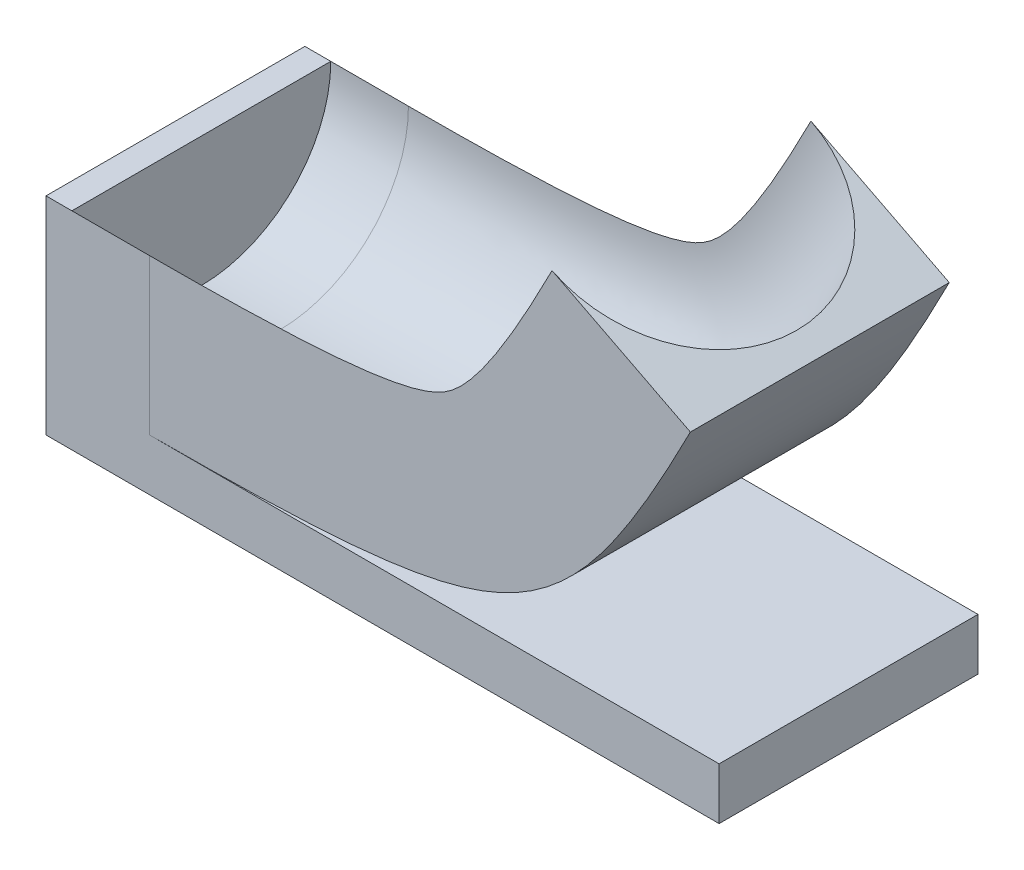
ISO-10303-21;
HEADER;
FILE_DESCRIPTION(('STEP AP214'),'2;1');
FILE_NAME('part.step','',(''),(''),'','','');
FILE_SCHEMA(('AUTOMOTIVE_DESIGN { 1 0 10303 214 1 1 1 1 }'));
ENDSEC;
DATA;
#1=APPLICATION_CONTEXT('core data for automotive mechanical design processes');
#2=APPLICATION_PROTOCOL_DEFINITION('international standard','automotive_design',2000,#1);
#3=PRODUCT_CONTEXT('',#1,'mechanical');
#4=PRODUCT('Part','Part','',(#3));
#5=PRODUCT_RELATED_PRODUCT_CATEGORY('part','',(#4));
#6=PRODUCT_DEFINITION_FORMATION('','',#4);
#7=PRODUCT_DEFINITION_CONTEXT('part definition',#1,'design');
#8=PRODUCT_DEFINITION('design','',#6,#7);
#9=PRODUCT_DEFINITION_SHAPE('','',#8);
#10=(LENGTH_UNIT() NAMED_UNIT(*) SI_UNIT(.MILLI.,.METRE.));
#11=(NAMED_UNIT(*) PLANE_ANGLE_UNIT() SI_UNIT($,.RADIAN.));
#12=(NAMED_UNIT(*) SI_UNIT($,.STERADIAN.) SOLID_ANGLE_UNIT());
#13=UNCERTAINTY_MEASURE_WITH_UNIT(LENGTH_MEASURE(1.E-05),#10,'distance_accuracy_value','');
#14=(GEOMETRIC_REPRESENTATION_CONTEXT(3) GLOBAL_UNCERTAINTY_ASSIGNED_CONTEXT((#13)) GLOBAL_UNIT_ASSIGNED_CONTEXT((#10,
#11,#12)) REPRESENTATION_CONTEXT('',''));
#15=CARTESIAN_POINT('',(0.,0.,0.));
#16=DIRECTION('',(0.,0.,1.));
#17=DIRECTION('',(1.,0.,0.));
#18=AXIS2_PLACEMENT_3D('',#15,#16,#17);
#19=CARTESIAN_POINT('',(-45.,40.,0.));
#20=DIRECTION('',(-1.,0.,0.));
#21=DIRECTION('',(0.,0.,1.));
#22=AXIS2_PLACEMENT_3D('',#19,#20,#21);
#23=CYLINDRICAL_SURFACE('',#22,25.);
#24=DIRECTION('',(-1.,0.,0.));
#25=VECTOR('',#24,1.);
#26=CARTESIAN_POINT('',(-45.,40.,-25.));
#27=LINE('',#26,#25);
#28=CARTESIAN_POINT('',(-45.,40.,-25.));
#29=VERTEX_POINT('',#28);
#30=CARTESIAN_POINT('',(-60.,40.,-25.));
#31=VERTEX_POINT('',#30);
#32=EDGE_CURVE('E113',#29,#31,#27,.T.);
#33=ORIENTED_EDGE('',*,*,#32,.T.);
#34=CARTESIAN_POINT('',(-60.,40.,0.));
#35=DIRECTION('',(-1.,0.,0.));
#36=DIRECTION('',(0.,0.,1.));
#37=AXIS2_PLACEMENT_3D('',#34,#35,#36);
#38=CIRCLE('',#37,25.);
#39=CARTESIAN_POINT('',(-60.,40.,25.));
#40=VERTEX_POINT('',#39);
#41=EDGE_CURVE('E11',#31,#40,#38,.T.);
#42=ORIENTED_EDGE('',*,*,#41,.T.);
#43=DIRECTION('',(-1.,0.,0.));
#44=VECTOR('',#43,1.);
#45=CARTESIAN_POINT('',(-45.,40.,25.));
#46=LINE('',#45,#44);
#47=CARTESIAN_POINT('',(-45.,40.,25.));
#48=VERTEX_POINT('',#47);
#49=EDGE_CURVE('E119',#48,#40,#46,.T.);
#50=ORIENTED_EDGE('',*,*,#49,.F.);
#51=CARTESIAN_POINT('',(-45.,40.,0.));
#52=DIRECTION('',(1.,0.,0.));
#53=DIRECTION('',(0.,0.,-1.));
#54=AXIS2_PLACEMENT_3D('',#51,#52,#53);
#55=CIRCLE('',#54,25.);
#56=EDGE_CURVE('E198',#48,#29,#55,.T.);
#57=ORIENTED_EDGE('',*,*,#56,.T.);
#58=EDGE_LOOP('',(#33,#42,#50,#57));
#59=FACE_BOUND('',#58,.T.);
#60=ADVANCED_FACE('F43',(#59),#23,.F.);
#61=CARTESIAN_POINT('',(65.,10.,25.));
#62=DIRECTION('',(-1.,0.,0.));
#63=DIRECTION('',(0.,0.,1.));
#64=AXIS2_PLACEMENT_3D('',#61,#62,#63);
#65=PLANE('',#64);
#66=DIRECTION('',(0.,0.,-1.));
#67=VECTOR('',#66,1.);
#68=CARTESIAN_POINT('',(65.,0.,25.));
#69=LINE('',#68,#67);
#70=CARTESIAN_POINT('',(65.,0.,25.));
#71=VERTEX_POINT('',#70);
#72=CARTESIAN_POINT('',(65.,0.,-25.));
#73=VERTEX_POINT('',#72);
#74=EDGE_CURVE('E106',#71,#73,#69,.T.);
#75=ORIENTED_EDGE('',*,*,#74,.T.);
#76=DIRECTION('',(0.,-1.,0.));
#77=VECTOR('',#76,1.);
#78=CARTESIAN_POINT('',(65.,10.,-25.));
#79=LINE('',#78,#77);
#80=CARTESIAN_POINT('',(65.,10.,-25.));
#81=VERTEX_POINT('',#80);
#82=EDGE_CURVE('E52',#81,#73,#79,.T.);
#83=ORIENTED_EDGE('',*,*,#82,.F.);
#84=DIRECTION('',(0.,0.,-1.));
#85=VECTOR('',#84,1.);
#86=CARTESIAN_POINT('',(65.,10.,25.));
#87=LINE('',#86,#85);
#88=CARTESIAN_POINT('',(65.,10.,25.));
#89=VERTEX_POINT('',#88);
#90=EDGE_CURVE('E100',#89,#81,#87,.T.);
#91=ORIENTED_EDGE('',*,*,#90,.F.);
#92=DIRECTION('',(0.,-1.,0.));
#93=VECTOR('',#92,1.);
#94=CARTESIAN_POINT('',(65.,10.,25.));
#95=LINE('',#94,#93);
#96=EDGE_CURVE('E91',#89,#71,#95,.T.);
#97=ORIENTED_EDGE('',*,*,#96,.T.);
#98=EDGE_LOOP('',(#75,#83,#91,#97));
#99=FACE_BOUND('',#98,.T.);
#100=ADVANCED_FACE('F45',(#99),#65,.F.);
#101=CARTESIAN_POINT('',(-65.,10.,-25.));
#102=DIRECTION('',(0.,0.,1.));
#103=DIRECTION('',(1.,0.,0.));
#104=AXIS2_PLACEMENT_3D('',#101,#102,#103);
#105=PLANE('',#104);
#106=DIRECTION('',(-1.,0.,0.));
#107=VECTOR('',#106,1.);
#108=CARTESIAN_POINT('',(-60.,40.,-25.));
#109=LINE('',#108,#107);
#110=CARTESIAN_POINT('',(-65.,40.,-25.));
#111=VERTEX_POINT('',#110);
#112=EDGE_CURVE('E174',#31,#111,#109,.T.);
#113=ORIENTED_EDGE('',*,*,#112,.F.);
#114=ORIENTED_EDGE('',*,*,#32,.F.);
#115=DIRECTION('',(0.,-1.,0.));
#116=VECTOR('',#115,1.);
#117=CARTESIAN_POINT('',(-45.,40.,-25.));
#118=LINE('',#117,#116);
#119=CARTESIAN_POINT('',(-45.,10.,-25.));
#120=VERTEX_POINT('',#119);
#121=EDGE_CURVE('E193',#29,#120,#118,.T.);
#122=ORIENTED_EDGE('',*,*,#121,.T.);
#123=DIRECTION('',(-1.,0.,0.));
#124=VECTOR('',#123,1.);
#125=CARTESIAN_POINT('',(-65.,10.,-25.));
#126=LINE('',#125,#124);
#127=EDGE_CURVE('E135',#81,#120,#126,.T.);
#128=ORIENTED_EDGE('',*,*,#127,.F.);
#129=ORIENTED_EDGE('',*,*,#82,.T.);
#130=DIRECTION('',(-1.,0.,0.));
#131=VECTOR('',#130,1.);
#132=CARTESIAN_POINT('',(-65.,0.,-25.));
#133=LINE('',#132,#131);
#134=CARTESIAN_POINT('',(-65.,0.,-25.));
#135=VERTEX_POINT('',#134);
#136=EDGE_CURVE('E110',#73,#135,#133,.T.);
#137=ORIENTED_EDGE('',*,*,#136,.T.);
#138=DIRECTION('',(0.,-1.,0.));
#139=VECTOR('',#138,1.);
#140=CARTESIAN_POINT('',(-65.,10.,-25.));
#141=LINE('',#140,#139);
#142=EDGE_CURVE('E129',#111,#135,#141,.T.);
#143=ORIENTED_EDGE('',*,*,#142,.F.);
#144=EDGE_LOOP('',(#113,#114,#122,#128,#129,#137,#143));
#145=FACE_BOUND('',#144,.T.);
#146=ADVANCED_FACE('F292',(#145),#105,.F.);
#147=CARTESIAN_POINT('',(-65.,10.,25.));
#148=DIRECTION('',(1.,0.,0.));
#149=DIRECTION('',(0.,0.,-1.));
#150=AXIS2_PLACEMENT_3D('',#147,#148,#149);
#151=PLANE('',#150);
#152=DIRECTION('',(0.,0.,1.));
#153=VECTOR('',#152,1.);
#154=CARTESIAN_POINT('',(-65.,0.,25.));
#155=LINE('',#154,#153);
#156=CARTESIAN_POINT('',(-65.,0.,25.));
#157=VERTEX_POINT('',#156);
#158=EDGE_CURVE('E101',#135,#157,#155,.T.);
#159=ORIENTED_EDGE('',*,*,#158,.T.);
#160=DIRECTION('',(0.,-1.,0.));
#161=VECTOR('',#160,1.);
#162=CARTESIAN_POINT('',(-65.,10.,25.));
#163=LINE('',#162,#161);
#164=CARTESIAN_POINT('',(-65.,40.,25.));
#165=VERTEX_POINT('',#164);
#166=EDGE_CURVE('E95',#165,#157,#163,.T.);
#167=ORIENTED_EDGE('',*,*,#166,.F.);
#168=DIRECTION('',(0.,0.,-1.));
#169=VECTOR('',#168,1.);
#170=CARTESIAN_POINT('',(-65.,40.,-25.));
#171=LINE('',#170,#169);
#172=EDGE_CURVE('E271',#165,#111,#171,.T.);
#173=ORIENTED_EDGE('',*,*,#172,.T.);
#174=ORIENTED_EDGE('',*,*,#142,.T.);
#175=EDGE_LOOP('',(#159,#167,#173,#174));
#176=FACE_BOUND('',#175,.T.);
#177=ADVANCED_FACE('F345',(#176),#151,.F.);
#178=CARTESIAN_POINT('',(-65.,10.,25.));
#179=DIRECTION('',(0.,0.,-1.));
#180=DIRECTION('',(-1.,0.,0.));
#181=AXIS2_PLACEMENT_3D('',#178,#179,#180);
#182=PLANE('',#181);
#183=DIRECTION('',(1.,0.,0.));
#184=VECTOR('',#183,1.);
#185=CARTESIAN_POINT('',(-65.,0.,25.));
#186=LINE('',#185,#184);
#187=EDGE_CURVE('E88',#157,#71,#186,.T.);
#188=ORIENTED_EDGE('',*,*,#187,.T.);
#189=ORIENTED_EDGE('',*,*,#96,.F.);
#190=DIRECTION('',(1.,0.,0.));
#191=VECTOR('',#190,1.);
#192=CARTESIAN_POINT('',(-65.,10.,25.));
#193=LINE('',#192,#191);
#194=CARTESIAN_POINT('',(-45.,10.,25.));
#195=VERTEX_POINT('',#194);
#196=EDGE_CURVE('E68',#195,#89,#193,.T.);
#197=ORIENTED_EDGE('',*,*,#196,.F.);
#198=DIRECTION('',(0.,1.,0.));
#199=VECTOR('',#198,1.);
#200=CARTESIAN_POINT('',(-45.,10.,25.));
#201=LINE('',#200,#199);
#202=EDGE_CURVE('E59',#195,#48,#201,.T.);
#203=ORIENTED_EDGE('',*,*,#202,.T.);
#204=ORIENTED_EDGE('',*,*,#49,.T.);
#205=DIRECTION('',(-1.,0.,0.));
#206=VECTOR('',#205,1.);
#207=CARTESIAN_POINT('',(-60.,40.,25.));
#208=LINE('',#207,#206);
#209=EDGE_CURVE('E264',#40,#165,#208,.T.);
#210=ORIENTED_EDGE('',*,*,#209,.T.);
#211=ORIENTED_EDGE('',*,*,#166,.T.);
#212=EDGE_LOOP('',(#188,#189,#197,#203,#204,#210,#211));
#213=FACE_BOUND('',#212,.T.);
#214=ADVANCED_FACE('F90',(#213),#182,.F.);
#215=CARTESIAN_POINT('',(0.,10.,0.));
#216=DIRECTION('',(0.,-1.,0.));
#217=DIRECTION('',(0.,0.,-1.));
#218=AXIS2_PLACEMENT_3D('',#215,#216,#217);
#219=PLANE('',#218);
#220=ORIENTED_EDGE('',*,*,#127,.T.);
#221=DIRECTION('',(0.,0.,1.));
#222=VECTOR('',#221,1.);
#223=CARTESIAN_POINT('',(-45.,10.,-25.));
#224=LINE('',#223,#222);
#225=EDGE_CURVE('E197',#120,#195,#224,.T.);
#226=ORIENTED_EDGE('',*,*,#225,.T.);
#227=ORIENTED_EDGE('',*,*,#196,.T.);
#228=ORIENTED_EDGE('',*,*,#90,.T.);
#229=EDGE_LOOP('',(#220,#226,#227,#228));
#230=FACE_BOUND('',#229,.T.);
#231=ADVANCED_FACE('F343',(#230),#219,.F.);
#232=CARTESIAN_POINT('',(0.,0.,0.));
#233=DIRECTION('',(0.,-1.,0.));
#234=DIRECTION('',(0.,0.,-1.));
#235=AXIS2_PLACEMENT_3D('',#232,#233,#234);
#236=PLANE('',#235);
#237=ORIENTED_EDGE('',*,*,#158,.F.);
#238=ORIENTED_EDGE('',*,*,#136,.F.);
#239=ORIENTED_EDGE('',*,*,#74,.F.);
#240=ORIENTED_EDGE('',*,*,#187,.F.);
#241=EDGE_LOOP('',(#237,#238,#239,#240));
#242=FACE_BOUND('',#241,.T.);
#243=ADVANCED_FACE('F109',(#242),#236,.T.);
#244=CARTESIAN_POINT('',(32.7371353433975,76.3738672966498,0.));
#245=DIRECTION('',(0.454954691865992,0.8905145862641,0.));
#246=DIRECTION('',(0.,0.,-1.));
#247=AXIS2_PLACEMENT_3D('',#244,#245,#246);
#248=PLANE('',#247);
#249=CARTESIAN_POINT('',(32.7371353433975,76.3738672966498,0.));
#250=DIRECTION('',(0.454954691865992,0.8905145862641,0.));
#251=DIRECTION('',(0.,0.,-1.));
#252=AXIS2_PLACEMENT_3D('',#249,#250,#251);
#253=CIRCLE('',#252,25.);
#254=CARTESIAN_POINT('',(32.7371353433975,76.3738672966498,25.));
#255=VERTEX_POINT('',#254);
#256=CARTESIAN_POINT('',(32.7371353433975,76.3738672966498,-25.));
#257=VERTEX_POINT('',#256);
#258=EDGE_CURVE('E169',#255,#257,#253,.T.);
#259=ORIENTED_EDGE('',*,*,#258,.F.);
#260=DIRECTION('',(-0.8905145862641,0.454954691865992,0.));
#261=VECTOR('',#260,1.);
#262=CARTESIAN_POINT('',(59.4525729313205,62.72522654067,25.));
#263=LINE('',#262,#261);
#264=CARTESIAN_POINT('',(59.4525729313205,62.72522654067,25.));
#265=VERTEX_POINT('',#264);
#266=EDGE_CURVE('E166',#265,#255,#263,.T.);
#267=ORIENTED_EDGE('',*,*,#266,.F.);
#268=DIRECTION('',(0.,0.,1.));
#269=VECTOR('',#268,1.);
#270=CARTESIAN_POINT('',(59.4525729313205,62.72522654067,-25.));
#271=LINE('',#270,#269);
#272=CARTESIAN_POINT('',(59.4525729313205,62.72522654067,-25.));
#273=VERTEX_POINT('',#272);
#274=EDGE_CURVE('E180',#273,#265,#271,.T.);
#275=ORIENTED_EDGE('',*,*,#274,.F.);
#276=DIRECTION('',(0.8905145862641,-0.454954691865992,0.));
#277=VECTOR('',#276,1.);
#278=CARTESIAN_POINT('',(32.7371353433975,76.3738672966498,-25.));
#279=LINE('',#278,#277);
#280=EDGE_CURVE('E173',#257,#273,#279,.T.);
#281=ORIENTED_EDGE('',*,*,#280,.F.);
#282=EDGE_LOOP('',(#259,#267,#275,#281));
#283=FACE_BOUND('',#282,.T.);
#284=ADVANCED_FACE('F320',(#283),#248,.T.);
#285=CARTESIAN_POINT('',(32.7371353433975,76.3738672966498,25.));
#286=CARTESIAN_POINT('',(30.4576584331843,71.912087972913,25.));
#287=CARTESIAN_POINT('',(28.5374108914578,68.3308047849084,25.));
#288=CARTESIAN_POINT('',(25.1457688744993,62.2889555036833,25.));
#289=CARTESIAN_POINT('',(23.6909410100106,59.8587850367874,25.));
#290=CARTESIAN_POINT('',(21.0934075655135,55.7683527124995,25.));
#291=CARTESIAN_POINT('',(19.9724711782589,54.1429079937814,25.));
#292=CARTESIAN_POINT('',(17.9697944808011,51.4400266548396,25.));
#293=CARTESIAN_POINT('',(17.1172217765495,50.4006131730246,25.));
#294=CARTESIAN_POINT('',(15.5781073791996,48.6748764102266,25.));
#295=CARTESIAN_POINT('',(14.9224647848668,48.0227432371391,25.));
#296=CARTESIAN_POINT('',(13.77240427649,46.9830336117312,25.));
#297=CARTESIAN_POINT('',(13.2692963313054,46.58471492174,25.));
#298=CARTESIAN_POINT('',(12.2341612844009,45.8507825019916,25.));
#299=CARTESIAN_POINT('',(11.7632838430434,45.5592003929403,25.));
#300=CARTESIAN_POINT('',(10.7138631745653,44.9904420790086,25.));
#301=CARTESIAN_POINT('',(10.134309761004,44.7148248879966,25.));
#302=CARTESIAN_POINT('',(8.70646019811122,44.1373054402215,25.));
#303=CARTESIAN_POINT('',(7.90365503694967,43.8546965721304,25.));
#304=CARTESIAN_POINT('',(5.96909418007388,43.2845507740936,25.));
#305=CARTESIAN_POINT('',(4.83812856138315,42.9987723800971,25.));
#306=CARTESIAN_POINT('',(0.846452082596889,42.1633382147724,25.));
#307=CARTESIAN_POINT('',(-2.54537940591736,41.6551857739707,25.));
#308=CARTESIAN_POINT('',(-11.2534452960898,40.8265262346096,25.));
#309=CARTESIAN_POINT('',(-16.5485216725974,40.5092621103665,25.));
#310=CARTESIAN_POINT('',(-26.0864672224142,40.1991701926098,25.));
#311=CARTESIAN_POINT('',(-29.531485438214,40.1229990162226,25.));
#312=CARTESIAN_POINT('',(-36.9180910773991,40.023414426792,25.));
#313=CARTESIAN_POINT('',(-40.865629788895,40.,25.));
#314=CARTESIAN_POINT('',(-45.,40.,25.));
#315=CARTESIAN_POINT('',(77.2628646566025,53.6261327033502,25.));
#316=CARTESIAN_POINT('',(74.7404339630525,48.6888029748954,25.));
#317=CARTESIAN_POINT('',(72.5091800200485,44.5177782455099,25.));
#318=CARTESIAN_POINT('',(68.3740626433873,37.1515067575878,25.));
#319=CARTESIAN_POINT('',(66.4531985324368,33.9270293004018,25.));
#320=CARTESIAN_POINT('',(62.748382887487,28.0929186429048,25.));
#321=CARTESIAN_POINT('',(60.945208360556,25.454323752528,25.));
#322=CARTESIAN_POINT('',(57.3450647069406,20.5954461432107,25.));
#323=CARTESIAN_POINT('',(55.5202100336207,18.3400372055243,25.));
#324=CARTESIAN_POINT('',(51.8058692861644,14.1753206925112,25.));
#325=CARTESIAN_POINT('',(49.884027115338,12.2259868037824,25.));
#326=CARTESIAN_POINT('',(45.8730393385466,8.59986229582647,25.));
#327=CARTESIAN_POINT('',(43.7925836503708,6.93381397234611,25.));
#328=CARTESIAN_POINT('',(39.5499502598855,3.92569891308391,25.));
#329=CARTESIAN_POINT('',(37.3289544236783,2.54387438233845,25.));
#330=CARTESIAN_POINT('',(32.7973706969074,0.0878755641934496,25.));
#331=CARTESIAN_POINT('',(30.4877926427101,-0.987858342562802,25.));
#332=CARTESIAN_POINT('',(25.8488402481368,-2.8641658370122,25.));
#333=CARTESIAN_POINT('',(23.4750910519021,-3.68238176594442,25.));
#334=CARTESIAN_POINT('',(18.6671003594439,-5.09937295735687,25.));
#335=CARTESIAN_POINT('',(16.2320687186857,-5.69990698752689,25.));
#336=CARTESIAN_POINT('',(8.78688344166669,-7.25813992619755,25.));
#337=CARTESIAN_POINT('',(3.56698644661735,-7.9890369597965,25.));
#338=CARTESIAN_POINT('',(-7.89260531017422,-9.07953164972264,25.));
#339=CARTESIAN_POINT('',(-14.1775671400474,-9.44007264284781,25.));
#340=CARTESIAN_POINT('',(-24.8348773355266,-9.7865566646115,25.));
#341=CARTESIAN_POINT('',(-28.5896870340086,-9.86884761866619,25.));
#342=CARTESIAN_POINT('',(-36.5118339028202,-9.97565225626279,25.));
#343=CARTESIAN_POINT('',(-40.6772652117149,-9.99999999999999,25.));
#344=CARTESIAN_POINT('',(-45.,-9.99999999999999,25.));
#345=CARTESIAN_POINT('',(77.2628646566025,53.6261327033502,-25.));
#346=CARTESIAN_POINT('',(74.7404339630525,48.6888029748954,-25.));
#347=CARTESIAN_POINT('',(72.5091800200485,44.5177782455099,-25.));
#348=CARTESIAN_POINT('',(68.3740626433873,37.1515067575878,-25.));
#349=CARTESIAN_POINT('',(66.4531985324368,33.9270293004018,-25.));
#350=CARTESIAN_POINT('',(62.748382887487,28.0929186429048,-25.));
#351=CARTESIAN_POINT('',(60.945208360556,25.454323752528,-25.));
#352=CARTESIAN_POINT('',(57.3450647069406,20.5954461432107,-25.));
#353=CARTESIAN_POINT('',(55.5202100336207,18.3400372055243,-25.));
#354=CARTESIAN_POINT('',(51.8058692861644,14.1753206925112,-25.));
#355=CARTESIAN_POINT('',(49.884027115338,12.2259868037824,-25.));
#356=CARTESIAN_POINT('',(45.8730393385466,8.59986229582647,-25.));
#357=CARTESIAN_POINT('',(43.7925836503708,6.93381397234611,-25.));
#358=CARTESIAN_POINT('',(39.5499502598855,3.92569891308391,-25.));
#359=CARTESIAN_POINT('',(37.3289544236783,2.54387438233845,-25.));
#360=CARTESIAN_POINT('',(32.7973706969074,0.0878755641934496,-25.));
#361=CARTESIAN_POINT('',(30.4877926427101,-0.987858342562802,-25.));
#362=CARTESIAN_POINT('',(25.8488402481368,-2.8641658370122,-25.));
#363=CARTESIAN_POINT('',(23.4750910519021,-3.68238176594442,-25.));
#364=CARTESIAN_POINT('',(18.6671003594439,-5.09937295735687,-25.));
#365=CARTESIAN_POINT('',(16.2320687186857,-5.69990698752689,-25.));
#366=CARTESIAN_POINT('',(8.78688344166669,-7.25813992619755,-25.));
#367=CARTESIAN_POINT('',(3.56698644661735,-7.9890369597965,-25.));
#368=CARTESIAN_POINT('',(-7.89260531017422,-9.07953164972264,-25.));
#369=CARTESIAN_POINT('',(-14.1775671400474,-9.44007264284781,-25.));
#370=CARTESIAN_POINT('',(-24.8348773355266,-9.7865566646115,-25.));
#371=CARTESIAN_POINT('',(-28.5896870340086,-9.86884761866619,-25.));
#372=CARTESIAN_POINT('',(-36.5118339028202,-9.97565225626279,-25.));
#373=CARTESIAN_POINT('',(-40.6772652117149,-9.99999999999999,-25.));
#374=CARTESIAN_POINT('',(-45.,-9.99999999999999,-25.));
#375=CARTESIAN_POINT('',(32.7371353433975,76.3738672966498,-25.));
#376=CARTESIAN_POINT('',(30.4576584331843,71.912087972913,-25.));
#377=CARTESIAN_POINT('',(28.5374108914578,68.3308047849084,-25.));
#378=CARTESIAN_POINT('',(25.1457688744993,62.2889555036833,-25.));
#379=CARTESIAN_POINT('',(23.6909410100106,59.8587850367874,-25.));
#380=CARTESIAN_POINT('',(21.0934075655135,55.7683527124995,-25.));
#381=CARTESIAN_POINT('',(19.9724711782589,54.1429079937814,-25.));
#382=CARTESIAN_POINT('',(17.9697944808011,51.4400266548396,-25.));
#383=CARTESIAN_POINT('',(17.1172217765495,50.4006131730246,-25.));
#384=CARTESIAN_POINT('',(15.5781073791996,48.6748764102266,-25.));
#385=CARTESIAN_POINT('',(14.9224647848668,48.0227432371391,-25.));
#386=CARTESIAN_POINT('',(13.77240427649,46.9830336117312,-25.));
#387=CARTESIAN_POINT('',(13.2692963313054,46.58471492174,-25.));
#388=CARTESIAN_POINT('',(12.2341612844009,45.8507825019916,-25.));
#389=CARTESIAN_POINT('',(11.7632838430434,45.5592003929403,-25.));
#390=CARTESIAN_POINT('',(10.7138631745653,44.9904420790086,-25.));
#391=CARTESIAN_POINT('',(10.134309761004,44.7148248879966,-25.));
#392=CARTESIAN_POINT('',(8.70646019811122,44.1373054402215,-25.));
#393=CARTESIAN_POINT('',(7.90365503694967,43.8546965721304,-25.));
#394=CARTESIAN_POINT('',(5.96909418007388,43.2845507740936,-25.));
#395=CARTESIAN_POINT('',(4.83812856138315,42.9987723800971,-25.));
#396=CARTESIAN_POINT('',(0.846452082596889,42.1633382147724,-25.));
#397=CARTESIAN_POINT('',(-2.54537940591736,41.6551857739707,-25.));
#398=CARTESIAN_POINT('',(-11.2534452960898,40.8265262346096,-25.));
#399=CARTESIAN_POINT('',(-16.5485216725974,40.5092621103665,-25.));
#400=CARTESIAN_POINT('',(-26.0864672224142,40.1991701926098,-25.));
#401=CARTESIAN_POINT('',(-29.531485438214,40.1229990162226,-25.));
#402=CARTESIAN_POINT('',(-36.9180910773991,40.023414426792,-25.));
#403=CARTESIAN_POINT('',(-40.865629788895,40.,-25.));
#404=CARTESIAN_POINT('',(-45.,40.,-25.));
#405=(BOUNDED_SURFACE() B_SPLINE_SURFACE(3,3,((#285,#286,#287,#288,#289,#290,#291,#292,#293,
#294,#295,#296,#297,#298,#299,#300,#301,#302,#303,#304,#305,#306,#307,#308,#309,#310,#311,#312,
#313,#314),(#315,#316,#317,#318,#319,#320,#321,#322,#323,#324,#325,#326,#327,#328,#329,#330,
#331,#332,#333,#334,#335,#336,#337,#338,#339,#340,#341,#342,#343,#344),(#345,#346,#347,#348,
#349,#350,#351,#352,#353,#354,#355,#356,#357,#358,#359,#360,#361,#362,#363,#364,#365,#366,#367,
#368,#369,#370,#371,#372,#373,#374),(#375,#376,#377,#378,#379,#380,#381,#382,#383,#384,#385,
#386,#387,#388,#389,#390,#391,#392,#393,#394,#395,#396,#397,#398,#399,#400,#401,#402,#403,
#404)),.UNSPECIFIED.,.F.,.F.,.F.) B_SPLINE_SURFACE_WITH_KNOTS((4,4),(4,2,2,2,2,2,2,2,2,2,2,2,2,
2,4),(0.,1.),(0.,0.0537273683940442,0.107454736788088,0.161182105182133,0.214909473576177,
0.268636841970221,0.322364210364265,0.376091578758309,0.429818947152353,0.483546315546398,
0.537273683940442,0.64472842072853,0.752183157516619,0.805910525910663,0.859637894304707),
.UNSPECIFIED.) GEOMETRIC_REPRESENTATION_ITEM() RATIONAL_B_SPLINE_SURFACE(((1.,1.,1.,1.,1.,1.,1.,
1.,1.,1.,1.,1.,1.,1.,1.,1.,1.,1.,1.,1.,1.,1.,1.,1.,1.,1.,1.,1.,1.,1.),(0.333333333333333,
0.333333333333333,0.333333333333333,0.333333333333333,0.333333333333333,0.333333333333333,
0.333333333333333,0.333333333333333,0.333333333333333,0.333333333333333,0.333333333333333,
0.333333333333333,0.333333333333333,0.333333333333333,0.333333333333333,0.333333333333333,
0.333333333333333,0.333333333333333,0.333333333333333,0.333333333333333,0.333333333333333,
0.333333333333333,0.333333333333333,0.333333333333333,0.333333333333333,0.333333333333333,
0.333333333333333,0.333333333333333,0.333333333333333,0.333333333333333),(0.333333333333333,
0.333333333333333,0.333333333333333,0.333333333333333,0.333333333333333,0.333333333333333,
0.333333333333333,0.333333333333333,0.333333333333333,0.333333333333333,0.333333333333333,
0.333333333333333,0.333333333333333,0.333333333333333,0.333333333333333,0.333333333333333,
0.333333333333333,0.333333333333333,0.333333333333333,0.333333333333333,0.333333333333333,
0.333333333333333,0.333333333333333,0.333333333333333,0.333333333333333,0.333333333333333,
0.333333333333333,0.333333333333333,0.333333333333333,0.333333333333333),(1.,1.,1.,1.,1.,1.,1.,
1.,1.,1.,1.,1.,1.,1.,1.,1.,1.,1.,1.,1.,1.,1.,1.,1.,1.,1.,1.,1.,1.,1.))) REPRESENTATION_ITEM('') SURFACE());
#406=CARTESIAN_POINT('',(32.7371353433975,76.3738672966498,-25.));
#407=CARTESIAN_POINT('',(30.4576584331843,71.912087972913,-25.));
#408=CARTESIAN_POINT('',(28.5374108914578,68.3308047849084,-25.));
#409=CARTESIAN_POINT('',(25.1457688744993,62.2889555036833,-25.));
#410=CARTESIAN_POINT('',(23.6909410100106,59.8587850367874,-25.));
#411=CARTESIAN_POINT('',(21.0934075655135,55.7683527124995,-25.));
#412=CARTESIAN_POINT('',(19.9724711782589,54.1429079937814,-25.));
#413=CARTESIAN_POINT('',(17.9697944808011,51.4400266548396,-25.));
#414=CARTESIAN_POINT('',(17.1172217765495,50.4006131730246,-25.));
#415=CARTESIAN_POINT('',(15.5781073791996,48.6748764102266,-25.));
#416=CARTESIAN_POINT('',(14.9224647848668,48.0227432371391,-25.));
#417=CARTESIAN_POINT('',(13.77240427649,46.9830336117312,-25.));
#418=CARTESIAN_POINT('',(13.2692963313054,46.58471492174,-25.));
#419=CARTESIAN_POINT('',(12.2341612844009,45.8507825019916,-25.));
#420=CARTESIAN_POINT('',(11.7632838430434,45.5592003929403,-25.));
#421=CARTESIAN_POINT('',(10.7138631745653,44.9904420790086,-25.));
#422=CARTESIAN_POINT('',(10.134309761004,44.7148248879966,-25.));
#423=CARTESIAN_POINT('',(8.70646019811122,44.1373054402215,-25.));
#424=CARTESIAN_POINT('',(7.90365503694967,43.8546965721304,-25.));
#425=CARTESIAN_POINT('',(5.96909418007388,43.2845507740936,-25.));
#426=CARTESIAN_POINT('',(4.83812856138315,42.9987723800971,-25.));
#427=CARTESIAN_POINT('',(0.846452082596889,42.1633382147724,-25.));
#428=CARTESIAN_POINT('',(-2.54537940591736,41.6551857739707,-25.));
#429=CARTESIAN_POINT('',(-11.2534452960898,40.8265262346096,-25.));
#430=CARTESIAN_POINT('',(-16.5485216725974,40.5092621103665,-25.));
#431=CARTESIAN_POINT('',(-26.0864672224142,40.1991701926098,-25.));
#432=CARTESIAN_POINT('',(-29.531485438214,40.1229990162226,-25.));
#433=CARTESIAN_POINT('',(-36.9180910773991,40.023414426792,-25.));
#434=CARTESIAN_POINT('',(-40.865629788895,40.,-25.));
#435=CARTESIAN_POINT('',(-45.,40.,-25.));
#436=(BOUNDED_CURVE() B_SPLINE_CURVE(3,(#406,#407,#408,#409,#410,#411,#412,#413,#414,#415,#416,
#417,#418,#419,#420,#421,#422,#423,#424,#425,#426,#427,#428,#429,#430,#431,#432,#433,#434,#435),
.UNSPECIFIED.,.F.,.F.) B_SPLINE_CURVE_WITH_KNOTS((4,2,2,2,2,2,2,2,2,2,2,2,2,2,4),(0.,
0.0537273683940442,0.107454736788088,0.161182105182133,0.214909473576177,0.268636841970221,
0.322364210364265,0.376091578758309,0.429818947152353,0.483546315546398,0.537273683940442,
0.64472842072853,0.752183157516619,0.805910525910663,0.859637894304707),
.UNSPECIFIED.) CURVE() GEOMETRIC_REPRESENTATION_ITEM() RATIONAL_B_SPLINE_CURVE((1.,1.,1.,1.,1.,
1.,1.,1.,1.,1.,1.,1.,1.,1.,1.,1.,1.,1.,1.,1.,1.,1.,1.,1.,1.,1.,1.,1.,1.,1.)) REPRESENTATION_ITEM(''));
#437=EDGE_CURVE('E148',#257,#29,#436,.T.);
#438=CARTESIAN_POINT('',(32.7371353433975,76.3738672966498,25.));
#439=CARTESIAN_POINT('',(30.4576584331843,71.912087972913,25.));
#440=CARTESIAN_POINT('',(28.5374108914578,68.3308047849084,25.));
#441=CARTESIAN_POINT('',(25.1457688744993,62.2889555036833,25.));
#442=CARTESIAN_POINT('',(23.6909410100106,59.8587850367874,25.));
#443=CARTESIAN_POINT('',(21.0934075655135,55.7683527124995,25.));
#444=CARTESIAN_POINT('',(19.9724711782589,54.1429079937814,25.));
#445=CARTESIAN_POINT('',(17.9697944808011,51.4400266548396,25.));
#446=CARTESIAN_POINT('',(17.1172217765495,50.4006131730246,25.));
#447=CARTESIAN_POINT('',(15.5781073791996,48.6748764102266,25.));
#448=CARTESIAN_POINT('',(14.9224647848668,48.0227432371391,25.));
#449=CARTESIAN_POINT('',(13.77240427649,46.9830336117312,25.));
#450=CARTESIAN_POINT('',(13.2692963313054,46.58471492174,25.));
#451=CARTESIAN_POINT('',(12.2341612844009,45.8507825019916,25.));
#452=CARTESIAN_POINT('',(11.7632838430434,45.5592003929403,25.));
#453=CARTESIAN_POINT('',(10.7138631745653,44.9904420790086,25.));
#454=CARTESIAN_POINT('',(10.134309761004,44.7148248879966,25.));
#455=CARTESIAN_POINT('',(8.70646019811122,44.1373054402215,25.));
#456=CARTESIAN_POINT('',(7.90365503694967,43.8546965721304,25.));
#457=CARTESIAN_POINT('',(5.96909418007388,43.2845507740936,25.));
#458=CARTESIAN_POINT('',(4.83812856138315,42.9987723800971,25.));
#459=CARTESIAN_POINT('',(0.846452082596889,42.1633382147724,25.));
#460=CARTESIAN_POINT('',(-2.54537940591736,41.6551857739707,25.));
#461=CARTESIAN_POINT('',(-11.2534452960898,40.8265262346096,25.));
#462=CARTESIAN_POINT('',(-16.5485216725974,40.5092621103665,25.));
#463=CARTESIAN_POINT('',(-26.0864672224142,40.1991701926098,25.));
#464=CARTESIAN_POINT('',(-29.531485438214,40.1229990162226,25.));
#465=CARTESIAN_POINT('',(-36.9180910773991,40.023414426792,25.));
#466=CARTESIAN_POINT('',(-40.865629788895,40.,25.));
#467=CARTESIAN_POINT('',(-45.,40.,25.));
#468=(BOUNDED_CURVE() B_SPLINE_CURVE(3,(#438,#439,#440,#441,#442,#443,#444,#445,#446,#447,#448,
#449,#450,#451,#452,#453,#454,#455,#456,#457,#458,#459,#460,#461,#462,#463,#464,#465,#466,#467),
.UNSPECIFIED.,.F.,.F.) B_SPLINE_CURVE_WITH_KNOTS((4,2,2,2,2,2,2,2,2,2,2,2,2,2,4),(0.,
0.0537273683940442,0.107454736788088,0.161182105182133,0.214909473576177,0.268636841970221,
0.322364210364265,0.376091578758309,0.429818947152353,0.483546315546398,0.537273683940442,
0.64472842072853,0.752183157516619,0.805910525910663,0.859637894304707),
.UNSPECIFIED.) CURVE() GEOMETRIC_REPRESENTATION_ITEM() RATIONAL_B_SPLINE_CURVE((1.,1.,1.,1.,1.,
1.,1.,1.,1.,1.,1.,1.,1.,1.,1.,1.,1.,1.,1.,1.,1.,1.,1.,1.,1.,1.,1.,1.,1.,1.)) REPRESENTATION_ITEM(''));
#469=EDGE_CURVE('E156',#255,#48,#468,.T.);
#470=ORIENTED_EDGE('',*,*,#437,.T.);
#471=ORIENTED_EDGE('',*,*,#56,.F.);
#472=ORIENTED_EDGE('',*,*,#469,.F.);
#473=ORIENTED_EDGE('',*,*,#258,.T.);
#474=EDGE_LOOP('',(#470,#471,#472,#473));
#475=FACE_BOUND('',#474,.T.);
#476=ADVANCED_FACE('F224',(#475),#405,.T.);
#477=CARTESIAN_POINT('',(32.7371353433975,76.3738672966498,-25.));
#478=DIRECTION('',(0.,0.,1.));
#479=DIRECTION('',(1.,0.,0.));
#480=AXIS2_PLACEMENT_3D('',#477,#478,#479);
#481=PLANE('',#480);
#482=CARTESIAN_POINT('',(59.4525729313205,62.72522654067,-25.));
#483=CARTESIAN_POINT('',(57.0273237510552,57.978116974131,-25.));
#484=CARTESIAN_POINT('',(54.9204723686095,54.0429888612666,-25.));
#485=CARTESIAN_POINT('',(51.0827451358347,47.2064862560286,-25.));
#486=CARTESIAN_POINT('',(49.3482955234602,44.299731594956,-25.));
#487=CARTESIAN_POINT('',(46.0863927587037,39.1630922707427,-25.));
#488=CARTESIAN_POINT('',(44.5561134876437,36.9297574490261,-25.));
#489=CARTESIAN_POINT('',(41.5949566164783,32.9332783478655,-25.));
#490=CARTESIAN_POINT('',(40.1590147307867,31.1642675925231,-25.));
#491=CARTESIAN_POINT('',(35.8926394196826,26.3805806731365,-25.));
#492=CARTESIAN_POINT('',(33.0630857492734,23.843395353823,-25.));
#493=CARTESIAN_POINT('',(27.1438176431629,19.6465113469276,-25.));
#494=CARTESIAN_POINT('',(24.023655120976,17.9716110875508,-25.));
#495=CARTESIAN_POINT('',(17.3146325971783,15.2580265359915,-25.));
#496=CARTESIAN_POINT('',(13.6957532416787,14.2026025692947,-25.));
#497=CARTESIAN_POINT('',(5.61071089803337,12.5104513301958,-25.));
#498=CARTESIAN_POINT('',(1.12204010560347,11.8686521337034,-25.));
#499=CARTESIAN_POINT('',(-9.23694130454046,10.8828915040173,-25.));
#500=CARTESIAN_POINT('',(-15.1259489530674,10.5396612584356,-25.));
#501=CARTESIAN_POINT('',(-25.3355132902816,10.2077340782782,-25.));
#502=CARTESIAN_POINT('',(-28.966406395712,10.127891035292,-25.));
#503=CARTESIAN_POINT('',(-36.6743367726306,10.0239744169564,-25.));
#504=CARTESIAN_POINT('',(-40.7526110426029,10.,-25.));
#505=CARTESIAN_POINT('',(-45.,10.,-25.));
#506=B_SPLINE_CURVE_WITH_KNOTS('',3,(#482,#483,#484,#485,#486,#487,#488,#489,#490,#491,#492,
#493,#494,#495,#496,#497,#498,#499,#500,#501,#502,#503,#504,#505),.UNSPECIFIED.,.F.,.F.,(4,2,2,
2,2,2,2,2,2,2,2,4),(0.,0.0537273683940442,0.107454736788088,0.161182105182133,0.214909473576177,
0.322364210364265,0.429818947152353,0.537273683940442,0.64472842072853,0.752183157516619,
0.805910525910663,0.859637894304707),.UNSPECIFIED.);
#507=EDGE_CURVE('E155',#273,#120,#506,.T.);
#508=ORIENTED_EDGE('',*,*,#507,.T.);
#509=ORIENTED_EDGE('',*,*,#121,.F.);
#510=ORIENTED_EDGE('',*,*,#437,.F.);
#511=ORIENTED_EDGE('',*,*,#280,.T.);
#512=EDGE_LOOP('',(#508,#509,#510,#511));
#513=FACE_BOUND('',#512,.T.);
#514=ADVANCED_FACE('F213',(#513),#481,.F.);
#515=CARTESIAN_POINT('',(59.4525729313205,62.72522654067,-25.));
#516=CARTESIAN_POINT('',(57.0273237510552,57.978116974131,-25.));
#517=CARTESIAN_POINT('',(54.9204723686095,54.0429888612666,-25.));
#518=CARTESIAN_POINT('',(51.0827451358347,47.2064862560286,-25.));
#519=CARTESIAN_POINT('',(49.3482955234602,44.299731594956,-25.));
#520=CARTESIAN_POINT('',(46.0863927587037,39.1630922707427,-25.));
#521=CARTESIAN_POINT('',(44.5561134876437,36.9297574490261,-25.));
#522=CARTESIAN_POINT('',(41.5949566164783,32.9332783478655,-25.));
#523=CARTESIAN_POINT('',(40.1590147307867,31.1642675925231,-25.));
#524=CARTESIAN_POINT('',(37.314764523384,27.9751429795987,-25.));
#525=CARTESIAN_POINT('',(35.8994021831495,26.5446893771227,-25.));
#526=CARTESIAN_POINT('',(33.032785313724,23.9531308221908,-25.));
#527=CARTESIAN_POINT('',(31.5832687227458,22.7941743520992,-25.));
#528=CARTESIAN_POINT('',(28.6236346696906,20.6957323486515,-25.));
#529=CARTESIAN_POINT('',(27.1026861914288,19.7500047865775,-25.));
#530=CARTESIAN_POINT('',(23.9639676879662,18.0489021701212,-25.));
#531=CARTESIAN_POINT('',(22.3463994900266,17.293214949661,-25.));
#532=CARTESIAN_POINT('',(18.9918882281277,15.9364226738813,-25.));
#533=CARTESIAN_POINT('',(17.2465166459163,15.3324495692855,-25.));
#534=CARTESIAN_POINT('',(13.5878978877007,14.2541965352233,-25.));
#535=CARTESIAN_POINT('',(11.6744926557674,13.77956475952,-25.));
#536=CARTESIAN_POINT('',(5.61071089803337,12.5104513301958,-25.));
#537=CARTESIAN_POINT('',(1.12204010560347,11.8686521337034,-25.));
#538=CARTESIAN_POINT('',(-9.23694130454046,10.8828915040173,-25.));
#539=CARTESIAN_POINT('',(-15.1259489530674,10.5396612584356,-25.));
#540=CARTESIAN_POINT('',(-25.3355132902816,10.2077340782782,-25.));
#541=CARTESIAN_POINT('',(-28.966406395712,10.127891035292,-25.));
#542=CARTESIAN_POINT('',(-36.6743367726306,10.0239744169564,-25.));
#543=CARTESIAN_POINT('',(-40.7526110426029,10.,-25.));
#544=CARTESIAN_POINT('',(-45.,10.,-25.));
#545=CARTESIAN_POINT('',(59.4525729313205,62.72522654067,25.));
#546=CARTESIAN_POINT('',(57.0273237510117,57.9781169741533,25.));
#547=CARTESIAN_POINT('',(54.9204723686095,54.0429888612666,25.));
#548=CARTESIAN_POINT('',(51.0827451358347,47.2064862560286,25.));
#549=CARTESIAN_POINT('',(49.3482955234704,44.299731594956,25.));
#550=CARTESIAN_POINT('',(46.0863927586935,39.1630922707427,25.));
#551=CARTESIAN_POINT('',(44.5561134876437,36.9297574490261,25.));
#552=CARTESIAN_POINT('',(41.5949566164783,32.9332783478655,25.));
#553=CARTESIAN_POINT('',(40.1590147307867,31.1642675925231,25.));
#554=CARTESIAN_POINT('',(37.314764523384,27.9751429795987,25.));
#555=CARTESIAN_POINT('',(35.8994021831495,26.5446893771227,25.));
#556=CARTESIAN_POINT('',(33.032785313724,23.9531308221908,25.));
#557=CARTESIAN_POINT('',(31.5832687227458,22.794174352102,25.));
#558=CARTESIAN_POINT('',(28.6236346696906,20.6957323486487,25.));
#559=CARTESIAN_POINT('',(27.1026861914288,19.7500047865803,25.));
#560=CARTESIAN_POINT('',(23.9639676879662,18.0489021701184,25.));
#561=CARTESIAN_POINT('',(22.3463994900266,17.2932149496581,25.));
#562=CARTESIAN_POINT('',(18.9918882281277,15.9364226738841,25.));
#563=CARTESIAN_POINT('',(17.2465166459163,15.3324495692855,25.));
#564=CARTESIAN_POINT('',(13.5878978877007,14.2541965352233,25.));
#565=CARTESIAN_POINT('',(11.6744926557674,13.77956475952,25.));
#566=CARTESIAN_POINT('',(5.61071089803337,12.5104513301958,25.));
#567=CARTESIAN_POINT('',(1.12204010560347,11.8686521337034,25.));
#568=CARTESIAN_POINT('',(-9.23694130454046,10.8828915040173,25.));
#569=CARTESIAN_POINT('',(-15.1259489530674,10.5396612584356,25.));
#570=CARTESIAN_POINT('',(-25.3355132902816,10.2077340782782,25.));
#571=CARTESIAN_POINT('',(-28.966406395712,10.127891035292,25.));
#572=CARTESIAN_POINT('',(-36.6743367726306,10.0239744169564,25.));
#573=CARTESIAN_POINT('',(-40.7526110426029,10.,25.));
#574=CARTESIAN_POINT('',(-45.,10.,25.));
#575=B_SPLINE_SURFACE_WITH_KNOTS('',1,3,((#515,#516,#517,#518,#519,#520,#521,#522,#523,#524,
#525,#526,#527,#528,#529,#530,#531,#532,#533,#534,#535,#536,#537,#538,#539,#540,#541,#542,#543,
#544),(#545,#546,#547,#548,#549,#550,#551,#552,#553,#554,#555,#556,#557,#558,#559,#560,#561,
#562,#563,#564,#565,#566,#567,#568,#569,#570,#571,#572,#573,#574)),.UNSPECIFIED.,.F.,.F.,.F.,(2,
2),(4,2,2,2,2,2,2,2,2,2,2,2,2,2,4),(0.,1.),(0.,0.0537273683940442,0.107454736788088,
0.161182105182133,0.214909473576177,0.268636841970221,0.322364210364265,0.376091578758309,
0.429818947152353,0.483546315546398,0.537273683940442,0.64472842072853,0.752183157516619,
0.805910525910663,0.859637894304707),.UNSPECIFIED.);
#576=CARTESIAN_POINT('',(59.4525729313205,62.72522654067,25.));
#577=CARTESIAN_POINT('',(57.0273237510117,57.9781169741533,25.));
#578=CARTESIAN_POINT('',(54.9204723686095,54.0429888612666,25.));
#579=CARTESIAN_POINT('',(51.0827451358347,47.2064862560286,25.));
#580=CARTESIAN_POINT('',(49.3482955234704,44.299731594956,25.));
#581=CARTESIAN_POINT('',(46.0863927586935,39.1630922707427,25.));
#582=CARTESIAN_POINT('',(44.5561134876437,36.9297574490261,25.));
#583=CARTESIAN_POINT('',(41.5949566164783,32.9332783478655,25.));
#584=CARTESIAN_POINT('',(40.1590147307867,31.1642675925231,25.));
#585=CARTESIAN_POINT('',(37.314764523384,27.9751429795987,25.));
#586=CARTESIAN_POINT('',(35.8994021831495,26.5446893771227,25.));
#587=CARTESIAN_POINT('',(33.032785313724,23.9531308221908,25.));
#588=CARTESIAN_POINT('',(31.5832687227458,22.794174352102,25.));
#589=CARTESIAN_POINT('',(28.6236346696906,20.6957323486487,25.));
#590=CARTESIAN_POINT('',(27.1026861914288,19.7500047865803,25.));
#591=CARTESIAN_POINT('',(23.9639676879662,18.0489021701184,25.));
#592=CARTESIAN_POINT('',(22.3463994900266,17.2932149496581,25.));
#593=CARTESIAN_POINT('',(18.9918882281277,15.9364226738841,25.));
#594=CARTESIAN_POINT('',(17.2465166459163,15.3324495692855,25.));
#595=CARTESIAN_POINT('',(13.5878978877007,14.2541965352233,25.));
#596=CARTESIAN_POINT('',(11.6744926557674,13.77956475952,25.));
#597=CARTESIAN_POINT('',(5.61071089803337,12.5104513301958,25.));
#598=CARTESIAN_POINT('',(1.12204010560347,11.8686521337034,25.));
#599=CARTESIAN_POINT('',(-9.23694130454046,10.8828915040173,25.));
#600=CARTESIAN_POINT('',(-15.1259489530674,10.5396612584356,25.));
#601=CARTESIAN_POINT('',(-25.3355132902816,10.2077340782782,25.));
#602=CARTESIAN_POINT('',(-28.966406395712,10.127891035292,25.));
#603=CARTESIAN_POINT('',(-36.6743367726306,10.0239744169564,25.));
#604=CARTESIAN_POINT('',(-40.7526110426029,10.,25.));
#605=CARTESIAN_POINT('',(-45.,10.,25.));
#606=B_SPLINE_CURVE_WITH_KNOTS('',3,(#576,#577,#578,#579,#580,#581,#582,#583,#584,#585,#586,
#587,#588,#589,#590,#591,#592,#593,#594,#595,#596,#597,#598,#599,#600,#601,#602,#603,#604,#605),
.UNSPECIFIED.,.F.,.F.,(4,2,2,2,2,2,2,2,2,2,2,2,2,2,4),(0.,0.0537273683940442,0.107454736788088,
0.161182105182133,0.214909473576177,0.268636841970221,0.322364210364265,0.376091578758309,
0.429818947152353,0.483546315546398,0.537273683940442,0.64472842072853,0.752183157516619,
0.805910525910663,0.859637894304707),.UNSPECIFIED.);
#607=EDGE_CURVE('E257',#265,#195,#606,.T.);
#608=ORIENTED_EDGE('',*,*,#607,.T.);
#609=ORIENTED_EDGE('',*,*,#225,.F.);
#610=ORIENTED_EDGE('',*,*,#507,.F.);
#611=ORIENTED_EDGE('',*,*,#274,.T.);
#612=EDGE_LOOP('',(#608,#609,#610,#611));
#613=FACE_BOUND('',#612,.T.);
#614=ADVANCED_FACE('F223',(#613),#575,.T.);
#615=CARTESIAN_POINT('',(59.4525729313205,62.72522654067,25.));
#616=DIRECTION('',(0.,0.,1.));
#617=DIRECTION('',(1.,0.,0.));
#618=AXIS2_PLACEMENT_3D('',#615,#616,#617);
#619=PLANE('',#618);
#620=ORIENTED_EDGE('',*,*,#202,.F.);
#621=ORIENTED_EDGE('',*,*,#607,.F.);
#622=ORIENTED_EDGE('',*,*,#266,.T.);
#623=ORIENTED_EDGE('',*,*,#469,.T.);
#624=EDGE_LOOP('',(#620,#621,#622,#623));
#625=FACE_BOUND('',#624,.T.);
#626=ADVANCED_FACE('F232',(#625),#619,.T.);
#627=CARTESIAN_POINT('',(-60.,0.,0.));
#628=DIRECTION('',(-1.,0.,0.));
#629=DIRECTION('',(0.,0.,1.));
#630=AXIS2_PLACEMENT_3D('',#627,#628,#629);
#631=PLANE('',#630);
#632=ORIENTED_EDGE('',*,*,#41,.F.);
#633=DIRECTION('',(0.,0.,-1.));
#634=VECTOR('',#633,1.);
#635=CARTESIAN_POINT('',(-60.,40.,-25.));
#636=LINE('',#635,#634);
#637=EDGE_CURVE('E267',#40,#31,#636,.T.);
#638=ORIENTED_EDGE('',*,*,#637,.F.);
#639=EDGE_LOOP('',(#632,#638));
#640=FACE_BOUND('',#639,.T.);
#641=ADVANCED_FACE('F388',(#640),#631,.F.);
#642=CARTESIAN_POINT('',(-60.,40.,-25.));
#643=DIRECTION('',(0.,1.,0.));
#644=DIRECTION('',(0.,0.,1.));
#645=AXIS2_PLACEMENT_3D('',#642,#643,#644);
#646=PLANE('',#645);
#647=ORIENTED_EDGE('',*,*,#172,.F.);
#648=ORIENTED_EDGE('',*,*,#209,.F.);
#649=ORIENTED_EDGE('',*,*,#637,.T.);
#650=ORIENTED_EDGE('',*,*,#112,.T.);
#651=EDGE_LOOP('',(#647,#648,#649,#650));
#652=FACE_BOUND('',#651,.T.);
#653=ADVANCED_FACE('F283',(#652),#646,.T.);
#654=CLOSED_SHELL('',(#60,#100,#146,#177,#214,#231,#243,#284,#476,#514,#614,#626,#641,#653));
#655=MANIFOLD_SOLID_BREP('B2',#654);
#656=ADVANCED_BREP_SHAPE_REPRESENTATION('',(#18,#655),#14);
#657=SHAPE_DEFINITION_REPRESENTATION(#9,#656);
ENDSEC;
END-ISO-10303-21;
